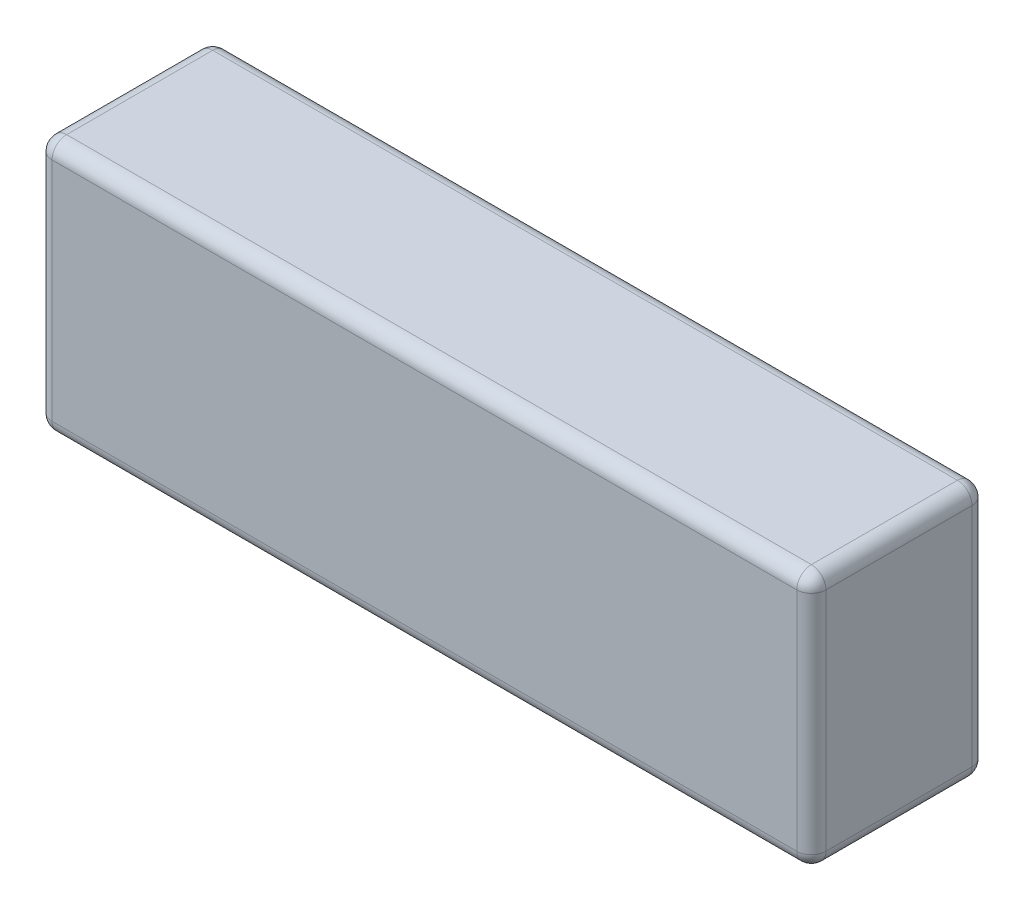
ISO-10303-21;
HEADER;
FILE_DESCRIPTION(('STEP AP214'),'2;1');
FILE_NAME('part.step','',(''),(''),'','','');
FILE_SCHEMA(('AUTOMOTIVE_DESIGN { 1 0 10303 214 1 1 1 1 }'));
ENDSEC;
DATA;
#1=APPLICATION_CONTEXT('core data for automotive mechanical design processes');
#2=APPLICATION_PROTOCOL_DEFINITION('international standard','automotive_design',2000,#1);
#3=PRODUCT_CONTEXT('',#1,'mechanical');
#4=PRODUCT('Part','Part','',(#3));
#5=PRODUCT_RELATED_PRODUCT_CATEGORY('part','',(#4));
#6=PRODUCT_DEFINITION_FORMATION('','',#4);
#7=PRODUCT_DEFINITION_CONTEXT('part definition',#1,'design');
#8=PRODUCT_DEFINITION('design','',#6,#7);
#9=PRODUCT_DEFINITION_SHAPE('','',#8);
#10=(LENGTH_UNIT() NAMED_UNIT(*) SI_UNIT(.MILLI.,.METRE.));
#11=(NAMED_UNIT(*) PLANE_ANGLE_UNIT() SI_UNIT($,.RADIAN.));
#12=(NAMED_UNIT(*) SI_UNIT($,.STERADIAN.) SOLID_ANGLE_UNIT());
#13=UNCERTAINTY_MEASURE_WITH_UNIT(LENGTH_MEASURE(1.E-05),#10,'distance_accuracy_value','');
#14=(GEOMETRIC_REPRESENTATION_CONTEXT(3) GLOBAL_UNCERTAINTY_ASSIGNED_CONTEXT((#13)) GLOBAL_UNIT_ASSIGNED_CONTEXT((#10,
#11,#12)) REPRESENTATION_CONTEXT('',''));
#15=CARTESIAN_POINT('',(0.,0.,0.));
#16=DIRECTION('',(0.,0.,1.));
#17=DIRECTION('',(1.,0.,0.));
#18=AXIS2_PLACEMENT_3D('',#15,#16,#17);
#19=CARTESIAN_POINT('',(-62.5650039022139,35.,-22.807978011175));
#20=DIRECTION('',(1.,0.,0.));
#21=DIRECTION('',(0.,0.,-1.));
#22=AXIS2_PLACEMENT_3D('',#19,#20,#21);
#23=PLANE('',#22);
#24=CARTESIAN_POINT('',(-62.5650039022139,18.7208480700782,-11.4465056239155));
#25=DIRECTION('',(1.,0.,0.));
#26=DIRECTION('',(0.,0.,-1.));
#27=AXIS2_PLACEMENT_3D('',#24,#25,#26);
#28=CIRCLE('',#27,7.98880999035675);
#29=CARTESIAN_POINT('',(-62.5650039022139,18.7208480700782,-19.4353156142722));
#30=VERTEX_POINT('',#29);
#31=EDGE_CURVE('E11',#30,#30,#28,.F.);
#32=ORIENTED_EDGE('',*,*,#31,.F.);
#33=EDGE_LOOP('',(#32));
#34=FACE_BOUND('',#33,.T.);
#35=DIRECTION('',(0.,0.,1.));
#36=VECTOR('',#35,1.);
#37=CARTESIAN_POINT('',(-62.5650039022139,2.,1.19202198882502));
#38=LINE('',#37,#36);
#39=CARTESIAN_POINT('',(-62.5650039022139,2.,-20.807978011175));
#40=VERTEX_POINT('',#39);
#41=CARTESIAN_POINT('',(-62.5650039022139,2.,-0.807978011174984));
#42=VERTEX_POINT('',#41);
#43=EDGE_CURVE('E217',#40,#42,#38,.T.);
#44=ORIENTED_EDGE('',*,*,#43,.T.);
#45=DIRECTION('',(0.,-1.,0.));
#46=VECTOR('',#45,1.);
#47=CARTESIAN_POINT('',(-62.5650039022139,35.,-0.807978011174985));
#48=LINE('',#47,#46);
#49=CARTESIAN_POINT('',(-62.5650039022139,33.,-0.807978011174984));
#50=VERTEX_POINT('',#49);
#51=EDGE_CURVE('E220',#42,#50,#48,.F.);
#52=ORIENTED_EDGE('',*,*,#51,.T.);
#53=DIRECTION('',(0.,0.,1.));
#54=VECTOR('',#53,1.);
#55=CARTESIAN_POINT('',(-62.5650039022139,33.,-22.807978011175));
#56=LINE('',#55,#54);
#57=CARTESIAN_POINT('',(-62.5650039022139,33.,-20.807978011175));
#58=VERTEX_POINT('',#57);
#59=EDGE_CURVE('E214',#50,#58,#56,.F.);
#60=ORIENTED_EDGE('',*,*,#59,.T.);
#61=DIRECTION('',(0.,-1.,0.));
#62=VECTOR('',#61,1.);
#63=CARTESIAN_POINT('',(-62.5650039022139,35.,-20.807978011175));
#64=LINE('',#63,#62);
#65=EDGE_CURVE('E211',#58,#40,#64,.T.);
#66=ORIENTED_EDGE('',*,*,#65,.T.);
#67=EDGE_LOOP('',(#44,#52,#60,#66));
#68=FACE_BOUND('',#67,.T.);
#69=ADVANCED_FACE('F42',(#34,#68),#23,.F.);
#70=CARTESIAN_POINT('',(43.4349960977861,35.,1.19202198882502));
#71=DIRECTION('',(0.,0.,-1.));
#72=DIRECTION('',(-1.,0.,0.));
#73=AXIS2_PLACEMENT_3D('',#70,#71,#72);
#74=PLANE('',#73);
#75=DIRECTION('',(1.,0.,0.));
#76=VECTOR('',#75,1.);
#77=CARTESIAN_POINT('',(43.4349960977861,33.,1.19202198882502));
#78=LINE('',#77,#76);
#79=CARTESIAN_POINT('',(41.4349960977861,33.,1.19202198882502));
#80=VERTEX_POINT('',#79);
#81=CARTESIAN_POINT('',(-60.5650039022139,33.,1.19202198882502));
#82=VERTEX_POINT('',#81);
#83=EDGE_CURVE('E162',#80,#82,#78,.F.);
#84=ORIENTED_EDGE('',*,*,#83,.T.);
#85=DIRECTION('',(0.,-1.,0.));
#86=VECTOR('',#85,1.);
#87=CARTESIAN_POINT('',(-60.5650039022139,35.,1.19202198882502));
#88=LINE('',#87,#86);
#89=CARTESIAN_POINT('',(-60.5650039022139,2.,1.19202198882502));
#90=VERTEX_POINT('',#89);
#91=EDGE_CURVE('E208',#82,#90,#88,.T.);
#92=ORIENTED_EDGE('',*,*,#91,.T.);
#93=DIRECTION('',(1.,0.,0.));
#94=VECTOR('',#93,1.);
#95=CARTESIAN_POINT('',(43.4349960977861,2.,1.19202198882502));
#96=LINE('',#95,#94);
#97=CARTESIAN_POINT('',(41.4349960977861,2.,1.19202198882502));
#98=VERTEX_POINT('',#97);
#99=EDGE_CURVE('E165',#90,#98,#96,.T.);
#100=ORIENTED_EDGE('',*,*,#99,.T.);
#101=DIRECTION('',(0.,-1.,0.));
#102=VECTOR('',#101,1.);
#103=CARTESIAN_POINT('',(41.4349960977861,35.,1.19202198882502));
#104=LINE('',#103,#102);
#105=EDGE_CURVE('E157',#98,#80,#104,.F.);
#106=ORIENTED_EDGE('',*,*,#105,.T.);
#107=EDGE_LOOP('',(#84,#92,#100,#106));
#108=FACE_BOUND('',#107,.T.);
#109=ADVANCED_FACE('F159',(#108),#74,.F.);
#110=CARTESIAN_POINT('',(43.4349960977861,35.,-22.807978011175));
#111=DIRECTION('',(-1.,0.,0.));
#112=DIRECTION('',(0.,0.,1.));
#113=AXIS2_PLACEMENT_3D('',#110,#111,#112);
#114=PLANE('',#113);
#115=DIRECTION('',(0.,-1.,0.));
#116=VECTOR('',#115,1.);
#117=CARTESIAN_POINT('',(43.4349960977861,35.,-0.807978011174985));
#118=LINE('',#117,#116);
#119=CARTESIAN_POINT('',(43.4349960977861,33.,-0.807978011174985));
#120=VERTEX_POINT('',#119);
#121=CARTESIAN_POINT('',(43.4349960977861,2.,-0.807978011174985));
#122=VERTEX_POINT('',#121);
#123=EDGE_CURVE('E176',#120,#122,#118,.T.);
#124=ORIENTED_EDGE('',*,*,#123,.T.);
#125=DIRECTION('',(0.,0.,-1.));
#126=VECTOR('',#125,1.);
#127=CARTESIAN_POINT('',(43.4349960977861,2.,-22.807978011175));
#128=LINE('',#127,#126);
#129=CARTESIAN_POINT('',(43.4349960977861,2.,-20.807978011175));
#130=VERTEX_POINT('',#129);
#131=EDGE_CURVE('E51',#122,#130,#128,.T.);
#132=ORIENTED_EDGE('',*,*,#131,.T.);
#133=DIRECTION('',(0.,-1.,0.));
#134=VECTOR('',#133,1.);
#135=CARTESIAN_POINT('',(43.4349960977861,35.,-20.807978011175));
#136=LINE('',#135,#134);
#137=CARTESIAN_POINT('',(43.4349960977861,33.,-20.807978011175));
#138=VERTEX_POINT('',#137);
#139=EDGE_CURVE('E68',#130,#138,#136,.F.);
#140=ORIENTED_EDGE('',*,*,#139,.T.);
#141=DIRECTION('',(0.,0.,-1.));
#142=VECTOR('',#141,1.);
#143=CARTESIAN_POINT('',(43.4349960977861,33.,-22.807978011175));
#144=LINE('',#143,#142);
#145=EDGE_CURVE('E264',#138,#120,#144,.F.);
#146=ORIENTED_EDGE('',*,*,#145,.T.);
#147=EDGE_LOOP('',(#124,#132,#140,#146));
#148=FACE_BOUND('',#147,.T.);
#149=ADVANCED_FACE('F346',(#148),#114,.F.);
#150=CARTESIAN_POINT('',(-62.5650039022139,35.,-22.807978011175));
#151=DIRECTION('',(0.,0.,1.));
#152=DIRECTION('',(1.,0.,0.));
#153=AXIS2_PLACEMENT_3D('',#150,#151,#152);
#154=PLANE('',#153);
#155=DIRECTION('',(-1.,0.,0.));
#156=VECTOR('',#155,1.);
#157=CARTESIAN_POINT('',(-62.5650039022139,2.,-22.807978011175));
#158=LINE('',#157,#156);
#159=CARTESIAN_POINT('',(41.4349960977861,2.,-22.807978011175));
#160=VERTEX_POINT('',#159);
#161=CARTESIAN_POINT('',(-60.5650039022139,2.,-22.807978011175));
#162=VERTEX_POINT('',#161);
#163=EDGE_CURVE('E252',#160,#162,#158,.T.);
#164=ORIENTED_EDGE('',*,*,#163,.T.);
#165=DIRECTION('',(0.,-1.,0.));
#166=VECTOR('',#165,1.);
#167=CARTESIAN_POINT('',(-60.5650039022139,35.,-22.807978011175));
#168=LINE('',#167,#166);
#169=CARTESIAN_POINT('',(-60.5650039022139,33.,-22.807978011175));
#170=VERTEX_POINT('',#169);
#171=EDGE_CURVE('E258',#162,#170,#168,.F.);
#172=ORIENTED_EDGE('',*,*,#171,.T.);
#173=DIRECTION('',(-1.,0.,0.));
#174=VECTOR('',#173,1.);
#175=CARTESIAN_POINT('',(-62.5650039022139,33.,-22.807978011175));
#176=LINE('',#175,#174);
#177=CARTESIAN_POINT('',(41.4349960977861,33.,-22.807978011175));
#178=VERTEX_POINT('',#177);
#179=EDGE_CURVE('E255',#170,#178,#176,.F.);
#180=ORIENTED_EDGE('',*,*,#179,.T.);
#181=DIRECTION('',(0.,-1.,0.));
#182=VECTOR('',#181,1.);
#183=CARTESIAN_POINT('',(41.4349960977861,35.,-22.807978011175));
#184=LINE('',#183,#182);
#185=EDGE_CURVE('E249',#178,#160,#184,.T.);
#186=ORIENTED_EDGE('',*,*,#185,.T.);
#187=EDGE_LOOP('',(#164,#172,#180,#186));
#188=FACE_BOUND('',#187,.T.);
#189=ADVANCED_FACE('F374',(#188),#154,.F.);
#190=CARTESIAN_POINT('',(0.,35.,0.));
#191=DIRECTION('',(0.,-1.,0.));
#192=DIRECTION('',(0.,0.,-1.));
#193=AXIS2_PLACEMENT_3D('',#190,#191,#192);
#194=PLANE('',#193);
#195=DIRECTION('',(-1.,0.,0.));
#196=VECTOR('',#195,1.);
#197=CARTESIAN_POINT('',(0.,35.,-20.807978011175));
#198=LINE('',#197,#196);
#199=CARTESIAN_POINT('',(41.4349960977861,35.,-20.807978011175));
#200=VERTEX_POINT('',#199);
#201=CARTESIAN_POINT('',(-60.5650039022139,35.,-20.807978011175));
#202=VERTEX_POINT('',#201);
#203=EDGE_CURVE('E242',#200,#202,#198,.T.);
#204=ORIENTED_EDGE('',*,*,#203,.T.);
#205=DIRECTION('',(0.,0.,1.));
#206=VECTOR('',#205,1.);
#207=CARTESIAN_POINT('',(-60.5650039022139,35.,0.));
#208=LINE('',#207,#206);
#209=CARTESIAN_POINT('',(-60.5650039022139,35.,-0.807978011174984));
#210=VERTEX_POINT('',#209);
#211=EDGE_CURVE('E245',#202,#210,#208,.T.);
#212=ORIENTED_EDGE('',*,*,#211,.T.);
#213=DIRECTION('',(1.,0.,0.));
#214=VECTOR('',#213,1.);
#215=CARTESIAN_POINT('',(0.,35.,-0.807978011174984));
#216=LINE('',#215,#214);
#217=CARTESIAN_POINT('',(41.4349960977861,35.,-0.807978011174984));
#218=VERTEX_POINT('',#217);
#219=EDGE_CURVE('E237',#210,#218,#216,.T.);
#220=ORIENTED_EDGE('',*,*,#219,.T.);
#221=DIRECTION('',(0.,0.,-1.));
#222=VECTOR('',#221,1.);
#223=CARTESIAN_POINT('',(41.4349960977861,35.,0.));
#224=LINE('',#223,#222);
#225=EDGE_CURVE('E239',#218,#200,#224,.T.);
#226=ORIENTED_EDGE('',*,*,#225,.T.);
#227=EDGE_LOOP('',(#204,#212,#220,#226));
#228=FACE_BOUND('',#227,.T.);
#229=ADVANCED_FACE('F394',(#228),#194,.F.);
#230=CARTESIAN_POINT('',(0.,0.,0.));
#231=DIRECTION('',(0.,-1.,0.));
#232=DIRECTION('',(0.,0.,-1.));
#233=AXIS2_PLACEMENT_3D('',#230,#231,#232);
#234=PLANE('',#233);
#235=DIRECTION('',(1.,0.,0.));
#236=VECTOR('',#235,1.);
#237=CARTESIAN_POINT('',(-62.5650039022139,0.,-0.807978011174984));
#238=LINE('',#237,#236);
#239=CARTESIAN_POINT('',(41.4349960977861,0.,-0.807978011174984));
#240=VERTEX_POINT('',#239);
#241=CARTESIAN_POINT('',(-60.5650039022139,0.,-0.807978011174984));
#242=VERTEX_POINT('',#241);
#243=EDGE_CURVE('E227',#240,#242,#238,.F.);
#244=ORIENTED_EDGE('',*,*,#243,.T.);
#245=DIRECTION('',(0.,0.,1.));
#246=VECTOR('',#245,1.);
#247=CARTESIAN_POINT('',(-60.5650039022139,0.,-22.807978011175));
#248=LINE('',#247,#246);
#249=CARTESIAN_POINT('',(-60.5650039022139,0.,-20.807978011175));
#250=VERTEX_POINT('',#249);
#251=EDGE_CURVE('E233',#242,#250,#248,.F.);
#252=ORIENTED_EDGE('',*,*,#251,.T.);
#253=DIRECTION('',(-1.,0.,0.));
#254=VECTOR('',#253,1.);
#255=CARTESIAN_POINT('',(43.4349960977861,0.,-20.807978011175));
#256=LINE('',#255,#254);
#257=CARTESIAN_POINT('',(41.4349960977861,0.,-20.807978011175));
#258=VERTEX_POINT('',#257);
#259=EDGE_CURVE('E230',#250,#258,#256,.F.);
#260=ORIENTED_EDGE('',*,*,#259,.T.);
#261=DIRECTION('',(0.,0.,-1.));
#262=VECTOR('',#261,1.);
#263=CARTESIAN_POINT('',(41.4349960977861,0.,1.19202198882502));
#264=LINE('',#263,#262);
#265=EDGE_CURVE('E224',#258,#240,#264,.F.);
#266=ORIENTED_EDGE('',*,*,#265,.T.);
#267=EDGE_LOOP('',(#244,#252,#260,#266));
#268=FACE_BOUND('',#267,.T.);
#269=ADVANCED_FACE('F358',(#268),#234,.T.);
#270=CARTESIAN_POINT('',(41.4349960977861,35.,-20.807978011175));
#271=DIRECTION('',(0.,-1.,0.));
#272=DIRECTION('',(0.,0.,-1.));
#273=AXIS2_PLACEMENT_3D('',#270,#271,#272);
#274=CYLINDRICAL_SURFACE('',#273,2.);
#275=CARTESIAN_POINT('',(41.4349960977861,33.,-20.807978011175));
#276=DIRECTION('',(0.,1.,0.));
#277=DIRECTION('',(0.,0.,1.));
#278=AXIS2_PLACEMENT_3D('',#275,#276,#277);
#279=CIRCLE('',#278,2.);
#280=EDGE_CURVE('E197',#138,#178,#279,.T.);
#281=ORIENTED_EDGE('',*,*,#280,.F.);
#282=ORIENTED_EDGE('',*,*,#139,.F.);
#283=CARTESIAN_POINT('',(41.4349960977861,2.,-20.807978011175));
#284=DIRECTION('',(0.,-1.,0.));
#285=DIRECTION('',(0.,0.,-1.));
#286=AXIS2_PLACEMENT_3D('',#283,#284,#285);
#287=CIRCLE('',#286,2.);
#288=EDGE_CURVE('E203',#160,#130,#287,.T.);
#289=ORIENTED_EDGE('',*,*,#288,.F.);
#290=ORIENTED_EDGE('',*,*,#185,.F.);
#291=EDGE_LOOP('',(#281,#282,#289,#290));
#292=FACE_BOUND('',#291,.T.);
#293=ADVANCED_FACE('F44',(#292),#274,.T.);
#294=CARTESIAN_POINT('',(41.4349960977861,33.,-20.807978011175));
#295=DIRECTION('',(0.,0.,-1.));
#296=DIRECTION('',(-1.,0.,0.));
#297=AXIS2_PLACEMENT_3D('',#294,#295,#296);
#298=SPHERICAL_SURFACE('',#297,2.);
#299=CARTESIAN_POINT('',(41.4349960977861,33.,-20.807978011175));
#300=DIRECTION('',(0.,0.,-1.));
#301=DIRECTION('',(-1.,0.,0.));
#302=AXIS2_PLACEMENT_3D('',#299,#300,#301);
#303=CIRCLE('',#302,2.);
#304=EDGE_CURVE('E329',#138,#200,#303,.F.);
#305=ORIENTED_EDGE('',*,*,#304,.F.);
#306=ORIENTED_EDGE('',*,*,#280,.T.);
#307=CARTESIAN_POINT('',(41.4349960977861,33.,-20.807978011175));
#308=DIRECTION('',(1.,0.,0.));
#309=DIRECTION('',(0.,0.,-1.));
#310=AXIS2_PLACEMENT_3D('',#307,#308,#309);
#311=CIRCLE('',#310,2.);
#312=EDGE_CURVE('E333',#200,#178,#311,.F.);
#313=ORIENTED_EDGE('',*,*,#312,.F.);
#314=EDGE_LOOP('',(#305,#306,#313));
#315=FACE_BOUND('',#314,.T.);
#316=ADVANCED_FACE('F388',(#315),#298,.T.);
#317=CARTESIAN_POINT('',(41.4349960977861,2.,-20.807978011175));
#318=DIRECTION('',(1.,0.,0.));
#319=DIRECTION('',(0.,1.,0.));
#320=AXIS2_PLACEMENT_3D('',#317,#318,#319);
#321=SPHERICAL_SURFACE('',#320,2.);
#322=CARTESIAN_POINT('',(41.4349960977861,2.,-20.807978011175));
#323=DIRECTION('',(1.,0.,0.));
#324=DIRECTION('',(0.,0.,-1.));
#325=AXIS2_PLACEMENT_3D('',#322,#323,#324);
#326=CIRCLE('',#325,2.);
#327=EDGE_CURVE('E323',#160,#258,#326,.F.);
#328=ORIENTED_EDGE('',*,*,#327,.F.);
#329=ORIENTED_EDGE('',*,*,#288,.T.);
#330=CARTESIAN_POINT('',(41.4349960977861,2.,-20.807978011175));
#331=DIRECTION('',(0.,0.,-1.));
#332=DIRECTION('',(-1.,0.,0.));
#333=AXIS2_PLACEMENT_3D('',#330,#331,#332);
#334=CIRCLE('',#333,2.);
#335=EDGE_CURVE('E60',#258,#130,#334,.F.);
#336=ORIENTED_EDGE('',*,*,#335,.F.);
#337=EDGE_LOOP('',(#328,#329,#336));
#338=FACE_BOUND('',#337,.T.);
#339=ADVANCED_FACE('F341',(#338),#321,.T.);
#340=CARTESIAN_POINT('',(0.,33.,-20.807978011175));
#341=DIRECTION('',(-1.,0.,0.));
#342=DIRECTION('',(0.,0.,1.));
#343=AXIS2_PLACEMENT_3D('',#340,#341,#342);
#344=CYLINDRICAL_SURFACE('',#343,2.);
#345=ORIENTED_EDGE('',*,*,#312,.T.);
#346=ORIENTED_EDGE('',*,*,#179,.F.);
#347=CARTESIAN_POINT('',(-60.5650039022139,33.,-20.807978011175));
#348=DIRECTION('',(-1.,0.,0.));
#349=DIRECTION('',(0.,0.,1.));
#350=AXIS2_PLACEMENT_3D('',#347,#348,#349);
#351=CIRCLE('',#350,2.);
#352=EDGE_CURVE('E316',#202,#170,#351,.T.);
#353=ORIENTED_EDGE('',*,*,#352,.F.);
#354=ORIENTED_EDGE('',*,*,#203,.F.);
#355=EDGE_LOOP('',(#345,#346,#353,#354));
#356=FACE_BOUND('',#355,.T.);
#357=ADVANCED_FACE('F384',(#356),#344,.T.);
#358=CARTESIAN_POINT('',(41.4349960977861,33.,0.));
#359=DIRECTION('',(0.,0.,-1.));
#360=DIRECTION('',(-1.,0.,0.));
#361=AXIS2_PLACEMENT_3D('',#358,#359,#360);
#362=CYLINDRICAL_SURFACE('',#361,2.);
#363=ORIENTED_EDGE('',*,*,#304,.T.);
#364=ORIENTED_EDGE('',*,*,#225,.F.);
#365=CARTESIAN_POINT('',(41.4349960977861,33.,-0.807978011174985));
#366=DIRECTION('',(0.,0.,1.));
#367=DIRECTION('',(0.,-1.,0.));
#368=AXIS2_PLACEMENT_3D('',#365,#366,#367);
#369=CIRCLE('',#368,2.);
#370=EDGE_CURVE('E181',#120,#218,#369,.T.);
#371=ORIENTED_EDGE('',*,*,#370,.F.);
#372=ORIENTED_EDGE('',*,*,#145,.F.);
#373=EDGE_LOOP('',(#363,#364,#371,#372));
#374=FACE_BOUND('',#373,.T.);
#375=ADVANCED_FACE('F392',(#374),#362,.T.);
#376=CARTESIAN_POINT('',(41.4349960977861,35.,-0.807978011174985));
#377=DIRECTION('',(0.,-1.,0.));
#378=DIRECTION('',(0.,0.,-1.));
#379=AXIS2_PLACEMENT_3D('',#376,#377,#378);
#380=CYLINDRICAL_SURFACE('',#379,2.);
#381=CARTESIAN_POINT('',(41.4349960977861,2.,-0.807978011174985));
#382=DIRECTION('',(0.,-1.,0.));
#383=DIRECTION('',(0.,0.,-1.));
#384=AXIS2_PLACEMENT_3D('',#381,#382,#383);
#385=CIRCLE('',#384,2.);
#386=EDGE_CURVE('E182',#122,#98,#385,.T.);
#387=ORIENTED_EDGE('',*,*,#386,.F.);
#388=ORIENTED_EDGE('',*,*,#123,.F.);
#389=CARTESIAN_POINT('',(41.4349960977861,33.,-0.807978011174984));
#390=DIRECTION('',(0.,1.,0.));
#391=DIRECTION('',(0.,0.,1.));
#392=AXIS2_PLACEMENT_3D('',#389,#390,#391);
#393=CIRCLE('',#392,2.);
#394=EDGE_CURVE('E173',#80,#120,#393,.T.);
#395=ORIENTED_EDGE('',*,*,#394,.F.);
#396=ORIENTED_EDGE('',*,*,#105,.F.);
#397=EDGE_LOOP('',(#387,#388,#395,#396));
#398=FACE_BOUND('',#397,.T.);
#399=ADVANCED_FACE('F175',(#398),#380,.T.);
#400=CARTESIAN_POINT('',(41.4349960977861,2.,-22.807978011175));
#401=DIRECTION('',(0.,0.,1.));
#402=DIRECTION('',(1.,0.,0.));
#403=AXIS2_PLACEMENT_3D('',#400,#401,#402);
#404=CYLINDRICAL_SURFACE('',#403,2.);
#405=ORIENTED_EDGE('',*,*,#335,.T.);
#406=ORIENTED_EDGE('',*,*,#131,.F.);
#407=CARTESIAN_POINT('',(41.4349960977861,2.,-0.807978011174984));
#408=DIRECTION('',(0.,0.,1.));
#409=DIRECTION('',(1.,0.,0.));
#410=AXIS2_PLACEMENT_3D('',#407,#408,#409);
#411=CIRCLE('',#410,2.);
#412=EDGE_CURVE('E308',#240,#122,#411,.T.);
#413=ORIENTED_EDGE('',*,*,#412,.F.);
#414=ORIENTED_EDGE('',*,*,#265,.F.);
#415=EDGE_LOOP('',(#405,#406,#413,#414));
#416=FACE_BOUND('',#415,.T.);
#417=ADVANCED_FACE('F348',(#416),#404,.T.);
#418=CARTESIAN_POINT('',(-62.5650039022139,2.,-20.807978011175));
#419=DIRECTION('',(1.,0.,0.));
#420=DIRECTION('',(0.,0.,-1.));
#421=AXIS2_PLACEMENT_3D('',#418,#419,#420);
#422=CYLINDRICAL_SURFACE('',#421,2.);
#423=ORIENTED_EDGE('',*,*,#327,.T.);
#424=ORIENTED_EDGE('',*,*,#259,.F.);
#425=CARTESIAN_POINT('',(-60.5650039022139,2.,-20.807978011175));
#426=DIRECTION('',(-1.,0.,0.));
#427=DIRECTION('',(0.,0.,1.));
#428=AXIS2_PLACEMENT_3D('',#425,#426,#427);
#429=CIRCLE('',#428,2.);
#430=EDGE_CURVE('E304',#162,#250,#429,.T.);
#431=ORIENTED_EDGE('',*,*,#430,.F.);
#432=ORIENTED_EDGE('',*,*,#163,.F.);
#433=EDGE_LOOP('',(#423,#424,#431,#432));
#434=FACE_BOUND('',#433,.T.);
#435=ADVANCED_FACE('F371',(#434),#422,.T.);
#436=CARTESIAN_POINT('',(-60.5650039022139,35.,-20.807978011175));
#437=DIRECTION('',(0.,-1.,0.));
#438=DIRECTION('',(0.,0.,-1.));
#439=AXIS2_PLACEMENT_3D('',#436,#437,#438);
#440=CYLINDRICAL_SURFACE('',#439,2.);
#441=CARTESIAN_POINT('',(-60.5650039022139,33.,-20.807978011175));
#442=DIRECTION('',(0.,1.,0.));
#443=DIRECTION('',(0.,0.,1.));
#444=AXIS2_PLACEMENT_3D('',#441,#442,#443);
#445=CIRCLE('',#444,2.);
#446=EDGE_CURVE('E319',#170,#58,#445,.T.);
#447=ORIENTED_EDGE('',*,*,#446,.F.);
#448=ORIENTED_EDGE('',*,*,#171,.F.);
#449=CARTESIAN_POINT('',(-60.5650039022139,2.,-20.807978011175));
#450=DIRECTION('',(0.,-1.,0.));
#451=DIRECTION('',(0.,0.,-1.));
#452=AXIS2_PLACEMENT_3D('',#449,#450,#451);
#453=CIRCLE('',#452,2.);
#454=EDGE_CURVE('E300',#40,#162,#453,.T.);
#455=ORIENTED_EDGE('',*,*,#454,.F.);
#456=ORIENTED_EDGE('',*,*,#65,.F.);
#457=EDGE_LOOP('',(#447,#448,#455,#456));
#458=FACE_BOUND('',#457,.T.);
#459=ADVANCED_FACE('F377',(#458),#440,.T.);
#460=CARTESIAN_POINT('',(-60.5650039022139,33.,-20.807978011175));
#461=DIRECTION('',(0.,0.,-1.));
#462=DIRECTION('',(-1.,0.,0.));
#463=AXIS2_PLACEMENT_3D('',#460,#461,#462);
#464=SPHERICAL_SURFACE('',#463,2.);
#465=ORIENTED_EDGE('',*,*,#352,.T.);
#466=ORIENTED_EDGE('',*,*,#446,.T.);
#467=CARTESIAN_POINT('',(-60.5650039022139,33.,-20.807978011175));
#468=DIRECTION('',(0.,0.,-1.));
#469=DIRECTION('',(-1.,0.,0.));
#470=AXIS2_PLACEMENT_3D('',#467,#468,#469);
#471=CIRCLE('',#470,2.);
#472=EDGE_CURVE('E190',#202,#58,#471,.F.);
#473=ORIENTED_EDGE('',*,*,#472,.F.);
#474=EDGE_LOOP('',(#465,#466,#473));
#475=FACE_BOUND('',#474,.T.);
#476=ADVANCED_FACE('F497',(#475),#464,.T.);
#477=CARTESIAN_POINT('',(41.4349960977861,33.,-0.807978011174984));
#478=DIRECTION('',(1.,0.,0.));
#479=DIRECTION('',(0.,0.,-1.));
#480=AXIS2_PLACEMENT_3D('',#477,#478,#479);
#481=SPHERICAL_SURFACE('',#480,2.);
#482=ORIENTED_EDGE('',*,*,#394,.T.);
#483=ORIENTED_EDGE('',*,*,#370,.T.);
#484=CARTESIAN_POINT('',(41.4349960977861,33.,-0.807978011174984));
#485=DIRECTION('',(1.,0.,0.));
#486=DIRECTION('',(0.,0.,-1.));
#487=AXIS2_PLACEMENT_3D('',#484,#485,#486);
#488=CIRCLE('',#487,2.);
#489=EDGE_CURVE('E185',#80,#218,#488,.F.);
#490=ORIENTED_EDGE('',*,*,#489,.F.);
#491=EDGE_LOOP('',(#482,#483,#490));
#492=FACE_BOUND('',#491,.T.);
#493=ADVANCED_FACE('F186',(#492),#481,.T.);
#494=CARTESIAN_POINT('',(41.4349960977861,2.,-0.807978011174984));
#495=DIRECTION('',(1.,0.,0.));
#496=DIRECTION('',(0.,0.,-1.));
#497=AXIS2_PLACEMENT_3D('',#494,#495,#496);
#498=SPHERICAL_SURFACE('',#497,2.);
#499=ORIENTED_EDGE('',*,*,#412,.T.);
#500=ORIENTED_EDGE('',*,*,#386,.T.);
#501=CARTESIAN_POINT('',(41.4349960977861,2.,-0.807978011174984));
#502=DIRECTION('',(1.,0.,0.));
#503=DIRECTION('',(0.,0.,-1.));
#504=AXIS2_PLACEMENT_3D('',#501,#502,#503);
#505=CIRCLE('',#504,2.);
#506=EDGE_CURVE('E191',#240,#98,#505,.F.);
#507=ORIENTED_EDGE('',*,*,#506,.F.);
#508=EDGE_LOOP('',(#499,#500,#507));
#509=FACE_BOUND('',#508,.T.);
#510=ADVANCED_FACE('F351',(#509),#498,.T.);
#511=CARTESIAN_POINT('',(-60.5650039022139,2.,-20.807978011175));
#512=DIRECTION('',(0.,0.,-1.));
#513=DIRECTION('',(0.,1.,0.));
#514=AXIS2_PLACEMENT_3D('',#511,#512,#513);
#515=SPHERICAL_SURFACE('',#514,2.);
#516=ORIENTED_EDGE('',*,*,#454,.T.);
#517=ORIENTED_EDGE('',*,*,#430,.T.);
#518=CARTESIAN_POINT('',(-60.5650039022139,2.,-20.807978011175));
#519=DIRECTION('',(0.,0.,-1.));
#520=DIRECTION('',(-1.,0.,0.));
#521=AXIS2_PLACEMENT_3D('',#518,#519,#520);
#522=CIRCLE('',#521,2.);
#523=EDGE_CURVE('E291',#40,#250,#522,.F.);
#524=ORIENTED_EDGE('',*,*,#523,.F.);
#525=EDGE_LOOP('',(#516,#517,#524));
#526=FACE_BOUND('',#525,.T.);
#527=ADVANCED_FACE('F368',(#526),#515,.T.);
#528=CARTESIAN_POINT('',(-60.5650039022139,33.,0.));
#529=DIRECTION('',(0.,0.,1.));
#530=DIRECTION('',(1.,0.,0.));
#531=AXIS2_PLACEMENT_3D('',#528,#529,#530);
#532=CYLINDRICAL_SURFACE('',#531,2.);
#533=ORIENTED_EDGE('',*,*,#472,.T.);
#534=ORIENTED_EDGE('',*,*,#59,.F.);
#535=CARTESIAN_POINT('',(-60.5650039022139,33.,-0.807978011174984));
#536=DIRECTION('',(0.,0.,1.));
#537=DIRECTION('',(1.,0.,0.));
#538=AXIS2_PLACEMENT_3D('',#535,#536,#537);
#539=CIRCLE('',#538,2.);
#540=EDGE_CURVE('E287',#210,#50,#539,.T.);
#541=ORIENTED_EDGE('',*,*,#540,.F.);
#542=ORIENTED_EDGE('',*,*,#211,.F.);
#543=EDGE_LOOP('',(#533,#534,#541,#542));
#544=FACE_BOUND('',#543,.T.);
#545=ADVANCED_FACE('F398',(#544),#532,.T.);
#546=CARTESIAN_POINT('',(0.,33.,-0.807978011174984));
#547=DIRECTION('',(1.,0.,0.));
#548=DIRECTION('',(0.,0.,-1.));
#549=AXIS2_PLACEMENT_3D('',#546,#547,#548);
#550=CYLINDRICAL_SURFACE('',#549,2.);
#551=ORIENTED_EDGE('',*,*,#489,.T.);
#552=ORIENTED_EDGE('',*,*,#219,.F.);
#553=CARTESIAN_POINT('',(-60.5650039022139,33.,-0.807978011174984));
#554=DIRECTION('',(-1.,0.,0.));
#555=DIRECTION('',(0.,0.,1.));
#556=AXIS2_PLACEMENT_3D('',#553,#554,#555);
#557=CIRCLE('',#556,2.);
#558=EDGE_CURVE('E194',#82,#210,#557,.T.);
#559=ORIENTED_EDGE('',*,*,#558,.F.);
#560=ORIENTED_EDGE('',*,*,#83,.F.);
#561=EDGE_LOOP('',(#551,#552,#559,#560));
#562=FACE_BOUND('',#561,.T.);
#563=ADVANCED_FACE('F193',(#562),#550,.T.);
#564=CARTESIAN_POINT('',(43.4349960977861,2.,-0.807978011174984));
#565=DIRECTION('',(-1.,0.,0.));
#566=DIRECTION('',(0.,0.,1.));
#567=AXIS2_PLACEMENT_3D('',#564,#565,#566);
#568=CYLINDRICAL_SURFACE('',#567,2.);
#569=ORIENTED_EDGE('',*,*,#506,.T.);
#570=ORIENTED_EDGE('',*,*,#99,.F.);
#571=CARTESIAN_POINT('',(-60.5650039022139,2.,-0.807978011174984));
#572=DIRECTION('',(-1.,0.,0.));
#573=DIRECTION('',(0.,0.,1.));
#574=AXIS2_PLACEMENT_3D('',#571,#572,#573);
#575=CIRCLE('',#574,2.);
#576=EDGE_CURVE('E281',#242,#90,#575,.T.);
#577=ORIENTED_EDGE('',*,*,#576,.F.);
#578=ORIENTED_EDGE('',*,*,#243,.F.);
#579=EDGE_LOOP('',(#569,#570,#577,#578));
#580=FACE_BOUND('',#579,.T.);
#581=ADVANCED_FACE('F355',(#580),#568,.T.);
#582=CARTESIAN_POINT('',(-60.5650039022139,2.,-22.807978011175));
#583=DIRECTION('',(0.,0.,-1.));
#584=DIRECTION('',(-1.,0.,0.));
#585=AXIS2_PLACEMENT_3D('',#582,#583,#584);
#586=CYLINDRICAL_SURFACE('',#585,2.);
#587=ORIENTED_EDGE('',*,*,#523,.T.);
#588=ORIENTED_EDGE('',*,*,#251,.F.);
#589=CARTESIAN_POINT('',(-60.5650039022139,2.,-0.807978011174984));
#590=DIRECTION('',(0.,0.,1.));
#591=DIRECTION('',(1.,0.,0.));
#592=AXIS2_PLACEMENT_3D('',#589,#590,#591);
#593=CIRCLE('',#592,2.);
#594=EDGE_CURVE('E277',#42,#242,#593,.T.);
#595=ORIENTED_EDGE('',*,*,#594,.F.);
#596=ORIENTED_EDGE('',*,*,#43,.F.);
#597=EDGE_LOOP('',(#587,#588,#595,#596));
#598=FACE_BOUND('',#597,.T.);
#599=ADVANCED_FACE('F361',(#598),#586,.T.);
#600=CARTESIAN_POINT('',(-60.5650039022139,33.,-0.807978011174984));
#601=DIRECTION('',(0.,1.,0.));
#602=DIRECTION('',(0.,0.,1.));
#603=AXIS2_PLACEMENT_3D('',#600,#601,#602);
#604=SPHERICAL_SURFACE('',#603,2.);
#605=ORIENTED_EDGE('',*,*,#558,.T.);
#606=ORIENTED_EDGE('',*,*,#540,.T.);
#607=CARTESIAN_POINT('',(-60.5650039022139,33.,-0.807978011174984));
#608=DIRECTION('',(0.,1.,0.));
#609=DIRECTION('',(0.,0.,1.));
#610=AXIS2_PLACEMENT_3D('',#607,#608,#609);
#611=CIRCLE('',#610,2.);
#612=EDGE_CURVE('E274',#82,#50,#611,.F.);
#613=ORIENTED_EDGE('',*,*,#612,.F.);
#614=EDGE_LOOP('',(#605,#606,#613));
#615=FACE_BOUND('',#614,.T.);
#616=ADVANCED_FACE('F401',(#615),#604,.T.);
#617=CARTESIAN_POINT('',(-60.5650039022139,2.,-0.807978011174984));
#618=DIRECTION('',(0.,-1.,0.));
#619=DIRECTION('',(0.,0.,-1.));
#620=AXIS2_PLACEMENT_3D('',#617,#618,#619);
#621=SPHERICAL_SURFACE('',#620,2.);
#622=ORIENTED_EDGE('',*,*,#594,.T.);
#623=ORIENTED_EDGE('',*,*,#576,.T.);
#624=CARTESIAN_POINT('',(-60.5650039022139,2.,-0.807978011174984));
#625=DIRECTION('',(0.,-1.,0.));
#626=DIRECTION('',(0.,0.,-1.));
#627=AXIS2_PLACEMENT_3D('',#624,#625,#626);
#628=CIRCLE('',#627,2.);
#629=EDGE_CURVE('E271',#42,#90,#628,.F.);
#630=ORIENTED_EDGE('',*,*,#629,.F.);
#631=EDGE_LOOP('',(#622,#623,#630));
#632=FACE_BOUND('',#631,.T.);
#633=ADVANCED_FACE('F407',(#632),#621,.T.);
#634=CARTESIAN_POINT('',(-60.5650039022139,35.,-0.807978011174984));
#635=DIRECTION('',(0.,-1.,0.));
#636=DIRECTION('',(0.,0.,-1.));
#637=AXIS2_PLACEMENT_3D('',#634,#635,#636);
#638=CYLINDRICAL_SURFACE('',#637,2.);
#639=ORIENTED_EDGE('',*,*,#612,.T.);
#640=ORIENTED_EDGE('',*,*,#51,.F.);
#641=ORIENTED_EDGE('',*,*,#629,.T.);
#642=ORIENTED_EDGE('',*,*,#91,.F.);
#643=EDGE_LOOP('',(#639,#640,#641,#642));
#644=FACE_BOUND('',#643,.T.);
#645=ADVANCED_FACE('F404',(#644),#638,.T.);
#646=CARTESIAN_POINT('',(-63.5650039022139,18.7208480700782,-11.4465056239155));
#647=DIRECTION('',(1.,0.,0.));
#648=DIRECTION('',(0.,0.,-1.));
#649=AXIS2_PLACEMENT_3D('',#646,#647,#648);
#650=CYLINDRICAL_SURFACE('',#649,7.98880999035675);
#651=CARTESIAN_POINT('',(-63.5650039022139,18.7208480700782,-11.4465056239155));
#652=DIRECTION('',(-1.,0.,0.));
#653=DIRECTION('',(0.,0.,1.));
#654=AXIS2_PLACEMENT_3D('',#651,#652,#653);
#655=CIRCLE('',#654,7.98880999035675);
#656=CARTESIAN_POINT('',(-63.5650039022139,18.7208480700782,-3.45769563355872));
#657=VERTEX_POINT('',#656);
#658=EDGE_CURVE('E205',#657,#657,#655,.T.);
#659=ORIENTED_EDGE('',*,*,#658,.F.);
#660=EDGE_LOOP('',(#659));
#661=FACE_BOUND('',#660,.T.);
#662=ORIENTED_EDGE('',*,*,#31,.T.);
#663=EDGE_LOOP('',(#662));
#664=FACE_BOUND('',#663,.T.);
#665=ADVANCED_FACE('F414',(#661,#664),#650,.T.);
#666=CARTESIAN_POINT('',(-63.5650039022139,18.7208480700782,-11.4465056239155));
#667=DIRECTION('',(-1.,0.,0.));
#668=DIRECTION('',(0.,0.,1.));
#669=AXIS2_PLACEMENT_3D('',#666,#667,#668);
#670=PLANE('',#669);
#671=ORIENTED_EDGE('',*,*,#658,.T.);
#672=EDGE_LOOP('',(#671));
#673=FACE_BOUND('',#672,.T.);
#674=ADVANCED_FACE('F437',(#673),#670,.T.);
#675=CLOSED_SHELL('',(#69,#109,#149,#189,#229,#269,#293,#316,#339,#357,#375,#399,#417,#435,#459,
#476,#493,#510,#527,#545,#563,#581,#599,#616,#633,#645,#665,#674));
#676=MANIFOLD_SOLID_BREP('B2',#675);
#677=ADVANCED_BREP_SHAPE_REPRESENTATION('',(#18,#676),#14);
#678=SHAPE_DEFINITION_REPRESENTATION(#9,#677);
ENDSEC;
END-ISO-10303-21;
